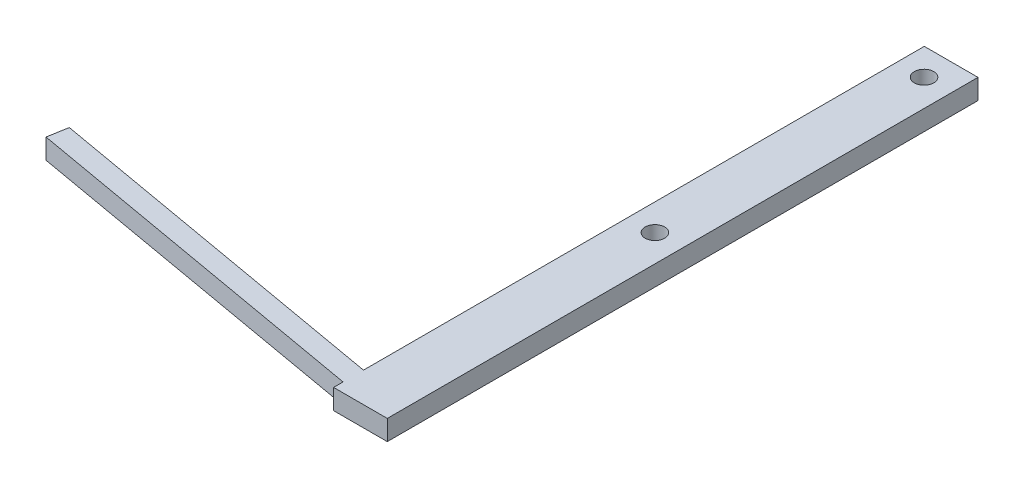
ISO-10303-21;
HEADER;
FILE_DESCRIPTION(('STEP AP214'),'2;1');
FILE_NAME('part.step','',(''),(''),'','','');
FILE_SCHEMA(('AUTOMOTIVE_DESIGN { 1 0 10303 214 1 1 1 1 }'));
ENDSEC;
DATA;
#1=APPLICATION_CONTEXT('core data for automotive mechanical design processes');
#2=APPLICATION_PROTOCOL_DEFINITION('international standard','automotive_design',2000,#1);
#3=PRODUCT_CONTEXT('',#1,'mechanical');
#4=PRODUCT('Part','Part','',(#3));
#5=PRODUCT_RELATED_PRODUCT_CATEGORY('part','',(#4));
#6=PRODUCT_DEFINITION_FORMATION('','',#4);
#7=PRODUCT_DEFINITION_CONTEXT('part definition',#1,'design');
#8=PRODUCT_DEFINITION('design','',#6,#7);
#9=PRODUCT_DEFINITION_SHAPE('','',#8);
#10=(LENGTH_UNIT() NAMED_UNIT(*) SI_UNIT(.MILLI.,.METRE.));
#11=(NAMED_UNIT(*) PLANE_ANGLE_UNIT() SI_UNIT($,.RADIAN.));
#12=(NAMED_UNIT(*) SI_UNIT($,.STERADIAN.) SOLID_ANGLE_UNIT());
#13=UNCERTAINTY_MEASURE_WITH_UNIT(LENGTH_MEASURE(1.E-05),#10,'distance_accuracy_value','');
#14=(GEOMETRIC_REPRESENTATION_CONTEXT(3) GLOBAL_UNCERTAINTY_ASSIGNED_CONTEXT((#13)) GLOBAL_UNIT_ASSIGNED_CONTEXT((#10,
#11,#12)) REPRESENTATION_CONTEXT('',''));
#15=CARTESIAN_POINT('',(0.,0.,0.));
#16=DIRECTION('',(0.,0.,1.));
#17=DIRECTION('',(1.,0.,0.));
#18=AXIS2_PLACEMENT_3D('',#15,#16,#17);
#19=CARTESIAN_POINT('',(0.,4.7625,-101.537542425712));
#20=DIRECTION('',(1.,0.,0.));
#21=DIRECTION('',(0.,0.,-1.));
#22=AXIS2_PLACEMENT_3D('',#19,#20,#21);
#23=PLANE('',#22);
#24=DIRECTION('',(0.,-1.,0.));
#25=VECTOR('',#24,1.);
#26=CARTESIAN_POINT('',(0.,92.3029556426417,31.0871356801851));
#27=LINE('',#26,#25);
#28=CARTESIAN_POINT('',(0.,4.7625,31.0871356801851));
#29=VERTEX_POINT('',#28);
#30=CARTESIAN_POINT('',(0.,0.,31.0871356801851));
#31=VERTEX_POINT('',#30);
#32=EDGE_CURVE('E58',#29,#31,#27,.T.);
#33=ORIENTED_EDGE('',*,*,#32,.F.);
#34=DIRECTION('',(0.,0.,1.));
#35=VECTOR('',#34,1.);
#36=CARTESIAN_POINT('',(0.,4.7625,-101.537542425712));
#37=LINE('',#36,#35);
#38=CARTESIAN_POINT('',(0.,4.7625,-101.537542425712));
#39=VERTEX_POINT('',#38);
#40=EDGE_CURVE('E153',#39,#29,#37,.T.);
#41=ORIENTED_EDGE('',*,*,#40,.F.);
#42=DIRECTION('',(0.,-1.,0.));
#43=VECTOR('',#42,1.);
#44=CARTESIAN_POINT('',(0.,4.7625,-101.537542425712));
#45=LINE('',#44,#43);
#46=CARTESIAN_POINT('',(0.,0.,-101.537542425712));
#47=VERTEX_POINT('',#46);
#48=EDGE_CURVE('E161',#39,#47,#45,.T.);
#49=ORIENTED_EDGE('',*,*,#48,.T.);
#50=DIRECTION('',(0.,0.,1.));
#51=VECTOR('',#50,1.);
#52=CARTESIAN_POINT('',(0.,0.,-101.537542425712));
#53=LINE('',#52,#51);
#54=EDGE_CURVE('E162',#47,#31,#53,.T.);
#55=ORIENTED_EDGE('',*,*,#54,.T.);
#56=EDGE_LOOP('',(#33,#41,#49,#55));
#57=FACE_BOUND('',#56,.T.);
#58=ADVANCED_FACE('F35',(#57),#23,.F.);
#59=CARTESIAN_POINT('',(0.,4.7625,0.));
#60=DIRECTION('',(0.,1.,0.));
#61=DIRECTION('',(0.,0.,1.));
#62=AXIS2_PLACEMENT_3D('',#59,#60,#61);
#63=PLANE('',#62);
#64=CARTESIAN_POINT('',(6.29321488132639,4.7625,-95.1875424257115));
#65=DIRECTION('',(0.,1.,0.));
#66=DIRECTION('',(0.,0.,1.));
#67=AXIS2_PLACEMENT_3D('',#64,#65,#66);
#68=CIRCLE('',#67,2.31);
#69=CARTESIAN_POINT('',(6.29321488132639,4.7625,-97.4975424257115));
#70=VERTEX_POINT('',#69);
#71=EDGE_CURVE('E148',#70,#70,#68,.T.);
#72=ORIENTED_EDGE('',*,*,#71,.F.);
#73=EDGE_LOOP('',(#72));
#74=FACE_BOUND('',#73,.T.);
#75=ORIENTED_EDGE('',*,*,#40,.T.);
#76=DIRECTION('',(0.984807753012209,0.,0.173648177666927));
#77=VECTOR('',#76,1.);
#78=CARTESIAN_POINT('',(-5.31621330046063,4.7625,30.1497438401127));
#79=LINE('',#78,#77);
#80=CARTESIAN_POINT('',(-84.461371978576,4.7625,16.1943169727086));
#81=VERTEX_POINT('',#80);
#82=EDGE_CURVE('E129',#81,#29,#79,.T.);
#83=ORIENTED_EDGE('',*,*,#82,.F.);
#84=DIRECTION('',(0.173648177666925,0.,-0.984807753012209));
#85=VECTOR('',#84,1.);
#86=CARTESIAN_POINT('',(-79.1451586781155,4.7625,-13.9554268674041));
#87=LINE('',#86,#85);
#88=CARTESIAN_POINT('',(-85.2883714247147,4.7625,20.8844638964292));
#89=VERTEX_POINT('',#88);
#90=EDGE_CURVE('E111',#89,#81,#87,.T.);
#91=ORIENTED_EDGE('',*,*,#90,.F.);
#92=DIRECTION('',(-0.984807753012209,0.,-0.173648177666928));
#93=VECTOR('',#92,1.);
#94=CARTESIAN_POINT('',(-6.14321274659937,4.7625,34.8398907638334));
#95=LINE('',#94,#93);
#96=CARTESIAN_POINT('',(0.,4.7625,35.923104919291));
#97=VERTEX_POINT('',#96);
#98=EDGE_CURVE('E108',#97,#89,#95,.T.);
#99=ORIENTED_EDGE('',*,*,#98,.F.);
#100=CARTESIAN_POINT('',(0.,4.7625,38.1624575742885));
#101=VERTEX_POINT('',#100);
#102=EDGE_CURVE('E50',#97,#101,#37,.T.);
#103=ORIENTED_EDGE('',*,*,#102,.T.);
#104=DIRECTION('',(1.,0.,0.));
#105=VECTOR('',#104,1.);
#106=CARTESIAN_POINT('',(0.,4.7625,38.1624575742885));
#107=LINE('',#106,#105);
#108=CARTESIAN_POINT('',(12.7,4.7625,38.1624575742885));
#109=VERTEX_POINT('',#108);
#110=EDGE_CURVE('E155',#101,#109,#107,.T.);
#111=ORIENTED_EDGE('',*,*,#110,.T.);
#112=DIRECTION('',(0.,0.,-1.));
#113=VECTOR('',#112,1.);
#114=CARTESIAN_POINT('',(12.7,4.7625,-101.537542425712));
#115=LINE('',#114,#113);
#116=CARTESIAN_POINT('',(12.7,4.7625,-101.537542425712));
#117=VERTEX_POINT('',#116);
#118=EDGE_CURVE('E157',#109,#117,#115,.T.);
#119=ORIENTED_EDGE('',*,*,#118,.T.);
#120=DIRECTION('',(-1.,0.,0.));
#121=VECTOR('',#120,1.);
#122=CARTESIAN_POINT('',(0.,4.7625,-101.537542425712));
#123=LINE('',#122,#121);
#124=EDGE_CURVE('E159',#117,#39,#123,.T.);
#125=ORIENTED_EDGE('',*,*,#124,.T.);
#126=EDGE_LOOP('',(#75,#83,#91,#99,#103,#111,#119,#125));
#127=FACE_BOUND('',#126,.T.);
#128=CARTESIAN_POINT('',(6.29321488132706,4.7625,-31.5375424257115));
#129=DIRECTION('',(0.,1.,0.));
#130=DIRECTION('',(0.,0.,1.));
#131=AXIS2_PLACEMENT_3D('',#128,#129,#130);
#132=CIRCLE('',#131,2.31);
#133=CARTESIAN_POINT('',(6.29321488132706,4.7625,-33.8475424257115));
#134=VERTEX_POINT('',#133);
#135=EDGE_CURVE('E142',#134,#134,#132,.T.);
#136=ORIENTED_EDGE('',*,*,#135,.F.);
#137=EDGE_LOOP('',(#136));
#138=FACE_BOUND('',#137,.T.);
#139=ADVANCED_FACE('F189',(#74,#127,#138),#63,.T.);
#140=CARTESIAN_POINT('',(0.,0.,0.));
#141=DIRECTION('',(0.,1.,0.));
#142=DIRECTION('',(0.,0.,1.));
#143=AXIS2_PLACEMENT_3D('',#140,#141,#142);
#144=PLANE('',#143);
#145=ORIENTED_EDGE('',*,*,#54,.F.);
#146=DIRECTION('',(-1.,0.,0.));
#147=VECTOR('',#146,1.);
#148=CARTESIAN_POINT('',(0.,0.,-101.537542425712));
#149=LINE('',#148,#147);
#150=CARTESIAN_POINT('',(12.7,0.,-101.537542425712));
#151=VERTEX_POINT('',#150);
#152=EDGE_CURVE('E168',#151,#47,#149,.T.);
#153=ORIENTED_EDGE('',*,*,#152,.F.);
#154=DIRECTION('',(0.,0.,-1.));
#155=VECTOR('',#154,1.);
#156=CARTESIAN_POINT('',(12.7,0.,-101.537542425712));
#157=LINE('',#156,#155);
#158=CARTESIAN_POINT('',(12.7,0.,38.1624575742885));
#159=VERTEX_POINT('',#158);
#160=EDGE_CURVE('E166',#159,#151,#157,.T.);
#161=ORIENTED_EDGE('',*,*,#160,.F.);
#162=DIRECTION('',(1.,0.,0.));
#163=VECTOR('',#162,1.);
#164=CARTESIAN_POINT('',(0.,0.,38.1624575742885));
#165=LINE('',#164,#163);
#166=CARTESIAN_POINT('',(0.,0.,38.1624575742885));
#167=VERTEX_POINT('',#166);
#168=EDGE_CURVE('E164',#167,#159,#165,.T.);
#169=ORIENTED_EDGE('',*,*,#168,.F.);
#170=CARTESIAN_POINT('',(0.,0.,35.923104919291));
#171=VERTEX_POINT('',#170);
#172=EDGE_CURVE('E128',#171,#167,#53,.T.);
#173=ORIENTED_EDGE('',*,*,#172,.F.);
#174=DIRECTION('',(-0.984807753012209,0.,-0.173648177666928));
#175=VECTOR('',#174,1.);
#176=CARTESIAN_POINT('',(-6.14321274659937,0.,34.8398907638334));
#177=LINE('',#176,#175);
#178=CARTESIAN_POINT('',(-85.2883714247147,0.,20.8844638964292));
#179=VERTEX_POINT('',#178);
#180=EDGE_CURVE('E107',#171,#179,#177,.T.);
#181=ORIENTED_EDGE('',*,*,#180,.T.);
#182=DIRECTION('',(0.173648177666925,0.,-0.984807753012209));
#183=VECTOR('',#182,1.);
#184=CARTESIAN_POINT('',(-79.1451586781155,0.,-13.9554268674041));
#185=LINE('',#184,#183);
#186=CARTESIAN_POINT('',(-84.461371978576,0.,16.1943169727085));
#187=VERTEX_POINT('',#186);
#188=EDGE_CURVE('E114',#179,#187,#185,.T.);
#189=ORIENTED_EDGE('',*,*,#188,.T.);
#190=DIRECTION('',(0.984807753012209,0.,0.173648177666927));
#191=VECTOR('',#190,1.);
#192=CARTESIAN_POINT('',(-5.31621330046063,0.,30.1497438401127));
#193=LINE('',#192,#191);
#194=EDGE_CURVE('E121',#187,#31,#193,.T.);
#195=ORIENTED_EDGE('',*,*,#194,.T.);
#196=EDGE_LOOP('',(#145,#153,#161,#169,#173,#181,#189,#195));
#197=FACE_BOUND('',#196,.T.);
#198=CARTESIAN_POINT('',(6.29321488132639,0.,-95.1875424257115));
#199=DIRECTION('',(0.,1.,0.));
#200=DIRECTION('',(0.,0.,1.));
#201=AXIS2_PLACEMENT_3D('',#198,#199,#200);
#202=CIRCLE('',#201,2.31);
#203=CARTESIAN_POINT('',(6.29321488132639,0.,-97.4975424257115));
#204=VERTEX_POINT('',#203);
#205=EDGE_CURVE('E145',#204,#204,#202,.T.);
#206=ORIENTED_EDGE('',*,*,#205,.T.);
#207=EDGE_LOOP('',(#206));
#208=FACE_BOUND('',#207,.T.);
#209=CARTESIAN_POINT('',(6.29321488132706,0.,-31.5375424257115));
#210=DIRECTION('',(0.,1.,0.));
#211=DIRECTION('',(0.,0.,1.));
#212=AXIS2_PLACEMENT_3D('',#209,#210,#211);
#213=CIRCLE('',#212,2.31);
#214=CARTESIAN_POINT('',(6.29321488132706,0.,-33.8475424257115));
#215=VERTEX_POINT('',#214);
#216=EDGE_CURVE('E141',#215,#215,#213,.T.);
#217=ORIENTED_EDGE('',*,*,#216,.T.);
#218=EDGE_LOOP('',(#217));
#219=FACE_BOUND('',#218,.T.);
#220=ADVANCED_FACE('F125',(#197,#208,#219),#144,.F.);
#221=ORIENTED_EDGE('',*,*,#102,.F.);
#222=DIRECTION('',(0.,-1.,0.));
#223=VECTOR('',#222,1.);
#224=CARTESIAN_POINT('',(0.,92.3029556426417,35.923104919291));
#225=LINE('',#224,#223);
#226=EDGE_CURVE('E136',#97,#171,#225,.T.);
#227=ORIENTED_EDGE('',*,*,#226,.T.);
#228=ORIENTED_EDGE('',*,*,#172,.T.);
#229=DIRECTION('',(0.,-1.,0.));
#230=VECTOR('',#229,1.);
#231=CARTESIAN_POINT('',(0.,4.7625,38.1624575742885));
#232=LINE('',#231,#230);
#233=EDGE_CURVE('E11',#101,#167,#232,.T.);
#234=ORIENTED_EDGE('',*,*,#233,.F.);
#235=EDGE_LOOP('',(#221,#227,#228,#234));
#236=FACE_BOUND('',#235,.T.);
#237=ADVANCED_FACE('F37',(#236),#23,.F.);
#238=CARTESIAN_POINT('',(0.,4.7625,38.1624575742885));
#239=DIRECTION('',(0.,0.,-1.));
#240=DIRECTION('',(-1.,0.,0.));
#241=AXIS2_PLACEMENT_3D('',#238,#239,#240);
#242=PLANE('',#241);
#243=ORIENTED_EDGE('',*,*,#168,.T.);
#244=DIRECTION('',(0.,-1.,0.));
#245=VECTOR('',#244,1.);
#246=CARTESIAN_POINT('',(12.7,4.7625,38.1624575742885));
#247=LINE('',#246,#245);
#248=EDGE_CURVE('E43',#109,#159,#247,.T.);
#249=ORIENTED_EDGE('',*,*,#248,.F.);
#250=ORIENTED_EDGE('',*,*,#110,.F.);
#251=ORIENTED_EDGE('',*,*,#233,.T.);
#252=EDGE_LOOP('',(#243,#249,#250,#251));
#253=FACE_BOUND('',#252,.T.);
#254=ADVANCED_FACE('F211',(#253),#242,.F.);
#255=CARTESIAN_POINT('',(12.7,4.7625,-101.537542425712));
#256=DIRECTION('',(-1.,0.,0.));
#257=DIRECTION('',(0.,0.,1.));
#258=AXIS2_PLACEMENT_3D('',#255,#256,#257);
#259=PLANE('',#258);
#260=ORIENTED_EDGE('',*,*,#160,.T.);
#261=DIRECTION('',(0.,-1.,0.));
#262=VECTOR('',#261,1.);
#263=CARTESIAN_POINT('',(12.7,4.7625,-101.537542425712));
#264=LINE('',#263,#262);
#265=EDGE_CURVE('E172',#117,#151,#264,.T.);
#266=ORIENTED_EDGE('',*,*,#265,.F.);
#267=ORIENTED_EDGE('',*,*,#118,.F.);
#268=ORIENTED_EDGE('',*,*,#248,.T.);
#269=EDGE_LOOP('',(#260,#266,#267,#268));
#270=FACE_BOUND('',#269,.T.);
#271=ADVANCED_FACE('F179',(#270),#259,.F.);
#272=CARTESIAN_POINT('',(0.,4.7625,-101.537542425712));
#273=DIRECTION('',(0.,0.,1.));
#274=DIRECTION('',(1.,0.,0.));
#275=AXIS2_PLACEMENT_3D('',#272,#273,#274);
#276=PLANE('',#275);
#277=ORIENTED_EDGE('',*,*,#152,.T.);
#278=ORIENTED_EDGE('',*,*,#48,.F.);
#279=ORIENTED_EDGE('',*,*,#124,.F.);
#280=ORIENTED_EDGE('',*,*,#265,.T.);
#281=EDGE_LOOP('',(#277,#278,#279,#280));
#282=FACE_BOUND('',#281,.T.);
#283=ADVANCED_FACE('F186',(#282),#276,.F.);
#284=CARTESIAN_POINT('',(6.29321488132639,4.7625,-95.1875424257115));
#285=DIRECTION('',(0.,-1.,0.));
#286=DIRECTION('',(0.,0.,-1.));
#287=AXIS2_PLACEMENT_3D('',#284,#285,#286);
#288=CYLINDRICAL_SURFACE('',#287,2.31);
#289=CARTESIAN_POINT('',(6.29321488132639,4.7625,-97.4975424257115));
#290=CARTESIAN_POINT('',(6.29321488132639,4.712890625,-97.4975424257115));
#291=CARTESIAN_POINT('',(6.29321488132639,4.66328125,-97.4975424257115));
#292=CARTESIAN_POINT('',(6.29321488132639,4.5640625,-97.4975424257115));
#293=CARTESIAN_POINT('',(6.29321488132639,4.514453125,-97.4975424257115));
#294=CARTESIAN_POINT('',(6.29321488132639,4.415234375,-97.4975424257115));
#295=CARTESIAN_POINT('',(6.29321488132639,4.365625,-97.4975424257115));
#296=CARTESIAN_POINT('',(6.29321488132639,4.26640625,-97.4975424257115));
#297=CARTESIAN_POINT('',(6.29321488132639,4.216796875,-97.4975424257115));
#298=CARTESIAN_POINT('',(6.29321488132639,4.117578125,-97.4975424257115));
#299=CARTESIAN_POINT('',(6.29321488132639,4.06796875,-97.4975424257115));
#300=CARTESIAN_POINT('',(6.29321488132639,3.96875,-97.4975424257115));
#301=CARTESIAN_POINT('',(6.29321488132639,3.919140625,-97.4975424257115));
#302=CARTESIAN_POINT('',(6.29321488132639,3.819921875,-97.4975424257115));
#303=CARTESIAN_POINT('',(6.29321488132639,3.7703125,-97.4975424257115));
#304=CARTESIAN_POINT('',(6.29321488132639,3.67109375,-97.4975424257115));
#305=CARTESIAN_POINT('',(6.29321488132639,3.621484375,-97.4975424257115));
#306=CARTESIAN_POINT('',(6.29321488132639,3.522265625,-97.4975424257115));
#307=CARTESIAN_POINT('',(6.29321488132639,3.47265625,-97.4975424257115));
#308=CARTESIAN_POINT('',(6.29321488132639,3.3734375,-97.4975424257115));
#309=CARTESIAN_POINT('',(6.29321488132639,3.323828125,-97.4975424257115));
#310=CARTESIAN_POINT('',(6.29321488132639,3.224609375,-97.4975424257115));
#311=CARTESIAN_POINT('',(6.29321488132639,3.175,-97.4975424257115));
#312=CARTESIAN_POINT('',(6.29321488132639,3.07578125,-97.4975424257115));
#313=CARTESIAN_POINT('',(6.29321488132639,3.026171875,-97.4975424257115));
#314=CARTESIAN_POINT('',(6.29321488132639,2.926953125,-97.4975424257115));
#315=CARTESIAN_POINT('',(6.29321488132639,2.87734375,-97.4975424257115));
#316=CARTESIAN_POINT('',(6.29321488132639,2.778125,-97.4975424257115));
#317=CARTESIAN_POINT('',(6.29321488132639,2.728515625,-97.4975424257115));
#318=CARTESIAN_POINT('',(6.29321488132639,2.629296875,-97.4975424257115));
#319=CARTESIAN_POINT('',(6.29321488132639,2.5796875,-97.4975424257115));
#320=CARTESIAN_POINT('',(6.29321488132639,2.48046875,-97.4975424257115));
#321=CARTESIAN_POINT('',(6.29321488132639,2.430859375,-97.4975424257115));
#322=CARTESIAN_POINT('',(6.29321488132639,2.331640625,-97.4975424257115));
#323=CARTESIAN_POINT('',(6.29321488132639,2.28203125,-97.4975424257115));
#324=CARTESIAN_POINT('',(6.29321488132639,2.1828125,-97.4975424257115));
#325=CARTESIAN_POINT('',(6.29321488132639,2.133203125,-97.4975424257115));
#326=CARTESIAN_POINT('',(6.29321488132639,2.033984375,-97.4975424257115));
#327=CARTESIAN_POINT('',(6.29321488132639,1.984375,-97.4975424257115));
#328=CARTESIAN_POINT('',(6.29321488132639,1.88515625,-97.4975424257115));
#329=CARTESIAN_POINT('',(6.29321488132639,1.835546875,-97.4975424257115));
#330=CARTESIAN_POINT('',(6.29321488132639,1.736328125,-97.4975424257115));
#331=CARTESIAN_POINT('',(6.29321488132639,1.68671875,-97.4975424257115));
#332=CARTESIAN_POINT('',(6.29321488132639,1.5875,-97.4975424257115));
#333=CARTESIAN_POINT('',(6.29321488132639,1.537890625,-97.4975424257115));
#334=CARTESIAN_POINT('',(6.29321488132639,1.438671875,-97.4975424257115));
#335=CARTESIAN_POINT('',(6.29321488132639,1.3890625,-97.4975424257115));
#336=CARTESIAN_POINT('',(6.29321488132639,1.28984375,-97.4975424257115));
#337=CARTESIAN_POINT('',(6.29321488132639,1.240234375,-97.4975424257115));
#338=CARTESIAN_POINT('',(6.29321488132639,1.141015625,-97.4975424257115));
#339=CARTESIAN_POINT('',(6.29321488132639,1.09140625,-97.4975424257115));
#340=CARTESIAN_POINT('',(6.29321488132639,0.9921875,-97.4975424257115));
#341=CARTESIAN_POINT('',(6.29321488132639,0.942578125,-97.4975424257115));
#342=CARTESIAN_POINT('',(6.29321488132639,0.843359375,-97.4975424257115));
#343=CARTESIAN_POINT('',(6.29321488132639,0.79375,-97.4975424257115));
#344=CARTESIAN_POINT('',(6.29321488132639,0.69453125,-97.4975424257115));
#345=CARTESIAN_POINT('',(6.29321488132639,0.644921875,-97.4975424257115));
#346=CARTESIAN_POINT('',(6.29321488132639,0.545703125,-97.4975424257115));
#347=CARTESIAN_POINT('',(6.29321488132639,0.49609375,-97.4975424257115));
#348=CARTESIAN_POINT('',(6.29321488132639,0.396875,-97.4975424257115));
#349=CARTESIAN_POINT('',(6.29321488132639,0.347265625,-97.4975424257115));
#350=CARTESIAN_POINT('',(6.29321488132639,0.248046875,-97.4975424257115));
#351=CARTESIAN_POINT('',(6.29321488132639,0.1984375,-97.4975424257115));
#352=CARTESIAN_POINT('',(6.29321488132639,0.09921875,-97.4975424257115));
#353=CARTESIAN_POINT('',(6.29321488132639,0.049609375,-97.4975424257115));
#354=CARTESIAN_POINT('',(6.29321488132639,0.,-97.4975424257115));
#355=B_SPLINE_CURVE_WITH_KNOTS('',3,(#289,#290,#291,#292,#293,#294,#295,#296,#297,#298,#299,
#300,#301,#302,#303,#304,#305,#306,#307,#308,#309,#310,#311,#312,#313,#314,#315,#316,#317,#318,
#319,#320,#321,#322,#323,#324,#325,#326,#327,#328,#329,#330,#331,#332,#333,#334,#335,#336,#337,
#338,#339,#340,#341,#342,#343,#344,#345,#346,#347,#348,#349,#350,#351,#352,#353,#354),
.UNSPECIFIED.,.F.,.F.,(4,2,2,2,2,2,2,2,2,2,2,2,2,2,2,2,2,2,2,2,2,2,2,2,2,2,2,2,2,2,2,2,4),(0.,
0.148828124999999,0.297656249999999,0.446484374999999,0.595312499999999,0.744140625,0.89296875,
1.041796875,1.190625,1.339453125,1.48828125,1.637109375,1.7859375,1.934765625,2.08359375,
2.232421875,2.38125,2.530078125,2.67890625,2.827734375,2.9765625,3.125390625,3.27421875,
3.423046875,3.571875,3.720703125,3.86953125,4.018359375,4.1671875,4.316015625,4.46484375,
4.613671875,4.7625),.UNSPECIFIED.);
#356=EDGE_CURVE('BSEAM201',#70,#204,#355,.T.);
#357=ORIENTED_EDGE('',*,*,#71,.T.);
#358=ORIENTED_EDGE('',*,*,#205,.F.);
#359=ORIENTED_EDGE('',*,*,#356,.T.);
#360=ORIENTED_EDGE('',*,*,#356,.F.);
#361=EDGE_LOOP('',(#357,#359,#358,#360));
#362=FACE_BOUND('',#361,.T.);
#363=ADVANCED_FACE('F201',(#362),#288,.F.);
#364=CARTESIAN_POINT('',(6.29321488132706,4.7625,-31.5375424257115));
#365=DIRECTION('',(0.,-1.,0.));
#366=DIRECTION('',(0.,0.,-1.));
#367=AXIS2_PLACEMENT_3D('',#364,#365,#366);
#368=CYLINDRICAL_SURFACE('',#367,2.31);
#369=CARTESIAN_POINT('',(6.29321488132706,4.7625,-33.8475424257115));
#370=CARTESIAN_POINT('',(6.29321488132706,4.712890625,-33.8475424257115));
#371=CARTESIAN_POINT('',(6.29321488132706,4.66328125,-33.8475424257115));
#372=CARTESIAN_POINT('',(6.29321488132706,4.5640625,-33.8475424257115));
#373=CARTESIAN_POINT('',(6.29321488132706,4.514453125,-33.8475424257115));
#374=CARTESIAN_POINT('',(6.29321488132706,4.415234375,-33.8475424257115));
#375=CARTESIAN_POINT('',(6.29321488132706,4.365625,-33.8475424257115));
#376=CARTESIAN_POINT('',(6.29321488132706,4.26640625,-33.8475424257115));
#377=CARTESIAN_POINT('',(6.29321488132706,4.216796875,-33.8475424257115));
#378=CARTESIAN_POINT('',(6.29321488132706,4.117578125,-33.8475424257115));
#379=CARTESIAN_POINT('',(6.29321488132706,4.06796875,-33.8475424257115));
#380=CARTESIAN_POINT('',(6.29321488132706,3.96875,-33.8475424257115));
#381=CARTESIAN_POINT('',(6.29321488132706,3.919140625,-33.8475424257115));
#382=CARTESIAN_POINT('',(6.29321488132706,3.819921875,-33.8475424257115));
#383=CARTESIAN_POINT('',(6.29321488132706,3.7703125,-33.8475424257115));
#384=CARTESIAN_POINT('',(6.29321488132706,3.67109375,-33.8475424257115));
#385=CARTESIAN_POINT('',(6.29321488132706,3.621484375,-33.8475424257115));
#386=CARTESIAN_POINT('',(6.29321488132706,3.522265625,-33.8475424257115));
#387=CARTESIAN_POINT('',(6.29321488132706,3.47265625,-33.8475424257115));
#388=CARTESIAN_POINT('',(6.29321488132706,3.3734375,-33.8475424257115));
#389=CARTESIAN_POINT('',(6.29321488132706,3.323828125,-33.8475424257115));
#390=CARTESIAN_POINT('',(6.29321488132706,3.224609375,-33.8475424257115));
#391=CARTESIAN_POINT('',(6.29321488132706,3.175,-33.8475424257115));
#392=CARTESIAN_POINT('',(6.29321488132706,3.07578125,-33.8475424257115));
#393=CARTESIAN_POINT('',(6.29321488132706,3.026171875,-33.8475424257115));
#394=CARTESIAN_POINT('',(6.29321488132706,2.926953125,-33.8475424257115));
#395=CARTESIAN_POINT('',(6.29321488132706,2.87734375,-33.8475424257115));
#396=CARTESIAN_POINT('',(6.29321488132706,2.778125,-33.8475424257115));
#397=CARTESIAN_POINT('',(6.29321488132706,2.728515625,-33.8475424257115));
#398=CARTESIAN_POINT('',(6.29321488132706,2.629296875,-33.8475424257115));
#399=CARTESIAN_POINT('',(6.29321488132706,2.5796875,-33.8475424257115));
#400=CARTESIAN_POINT('',(6.29321488132706,2.48046875,-33.8475424257115));
#401=CARTESIAN_POINT('',(6.29321488132706,2.430859375,-33.8475424257115));
#402=CARTESIAN_POINT('',(6.29321488132706,2.331640625,-33.8475424257115));
#403=CARTESIAN_POINT('',(6.29321488132706,2.28203125,-33.8475424257115));
#404=CARTESIAN_POINT('',(6.29321488132706,2.1828125,-33.8475424257115));
#405=CARTESIAN_POINT('',(6.29321488132706,2.133203125,-33.8475424257115));
#406=CARTESIAN_POINT('',(6.29321488132706,2.033984375,-33.8475424257115));
#407=CARTESIAN_POINT('',(6.29321488132706,1.984375,-33.8475424257115));
#408=CARTESIAN_POINT('',(6.29321488132706,1.88515625,-33.8475424257115));
#409=CARTESIAN_POINT('',(6.29321488132706,1.835546875,-33.8475424257115));
#410=CARTESIAN_POINT('',(6.29321488132706,1.736328125,-33.8475424257115));
#411=CARTESIAN_POINT('',(6.29321488132706,1.68671875,-33.8475424257115));
#412=CARTESIAN_POINT('',(6.29321488132706,1.5875,-33.8475424257115));
#413=CARTESIAN_POINT('',(6.29321488132706,1.537890625,-33.8475424257115));
#414=CARTESIAN_POINT('',(6.29321488132706,1.438671875,-33.8475424257115));
#415=CARTESIAN_POINT('',(6.29321488132706,1.3890625,-33.8475424257115));
#416=CARTESIAN_POINT('',(6.29321488132706,1.28984375,-33.8475424257115));
#417=CARTESIAN_POINT('',(6.29321488132706,1.240234375,-33.8475424257115));
#418=CARTESIAN_POINT('',(6.29321488132706,1.141015625,-33.8475424257115));
#419=CARTESIAN_POINT('',(6.29321488132706,1.09140625,-33.8475424257115));
#420=CARTESIAN_POINT('',(6.29321488132706,0.9921875,-33.8475424257115));
#421=CARTESIAN_POINT('',(6.29321488132706,0.942578125,-33.8475424257115));
#422=CARTESIAN_POINT('',(6.29321488132706,0.843359375,-33.8475424257115));
#423=CARTESIAN_POINT('',(6.29321488132706,0.79375,-33.8475424257115));
#424=CARTESIAN_POINT('',(6.29321488132706,0.69453125,-33.8475424257115));
#425=CARTESIAN_POINT('',(6.29321488132706,0.644921875,-33.8475424257115));
#426=CARTESIAN_POINT('',(6.29321488132706,0.545703125,-33.8475424257115));
#427=CARTESIAN_POINT('',(6.29321488132706,0.49609375,-33.8475424257115));
#428=CARTESIAN_POINT('',(6.29321488132706,0.396875,-33.8475424257115));
#429=CARTESIAN_POINT('',(6.29321488132706,0.347265625,-33.8475424257115));
#430=CARTESIAN_POINT('',(6.29321488132706,0.248046875,-33.8475424257115));
#431=CARTESIAN_POINT('',(6.29321488132706,0.1984375,-33.8475424257115));
#432=CARTESIAN_POINT('',(6.29321488132706,0.09921875,-33.8475424257115));
#433=CARTESIAN_POINT('',(6.29321488132706,0.049609375,-33.8475424257115));
#434=CARTESIAN_POINT('',(6.29321488132706,0.,-33.8475424257115));
#435=B_SPLINE_CURVE_WITH_KNOTS('',3,(#369,#370,#371,#372,#373,#374,#375,#376,#377,#378,#379,
#380,#381,#382,#383,#384,#385,#386,#387,#388,#389,#390,#391,#392,#393,#394,#395,#396,#397,#398,
#399,#400,#401,#402,#403,#404,#405,#406,#407,#408,#409,#410,#411,#412,#413,#414,#415,#416,#417,
#418,#419,#420,#421,#422,#423,#424,#425,#426,#427,#428,#429,#430,#431,#432,#433,#434),
.UNSPECIFIED.,.F.,.F.,(4,2,2,2,2,2,2,2,2,2,2,2,2,2,2,2,2,2,2,2,2,2,2,2,2,2,2,2,2,2,2,2,4),(0.,
0.148828124999999,0.297656249999999,0.446484374999999,0.595312499999999,0.744140625,0.89296875,
1.041796875,1.190625,1.339453125,1.48828125,1.637109375,1.7859375,1.934765625,2.08359375,
2.232421875,2.38125,2.530078125,2.67890625,2.827734375,2.9765625,3.125390625,3.27421875,
3.423046875,3.571875,3.720703125,3.86953125,4.018359375,4.1671875,4.316015625,4.46484375,
4.613671875,4.7625),.UNSPECIFIED.);
#436=EDGE_CURVE('BSEAM194',#134,#215,#435,.T.);
#437=ORIENTED_EDGE('',*,*,#135,.T.);
#438=ORIENTED_EDGE('',*,*,#216,.F.);
#439=ORIENTED_EDGE('',*,*,#436,.T.);
#440=ORIENTED_EDGE('',*,*,#436,.F.);
#441=EDGE_LOOP('',(#437,#439,#438,#440));
#442=FACE_BOUND('',#441,.T.);
#443=ADVANCED_FACE('F194',(#442),#368,.F.);
#444=CARTESIAN_POINT('',(-5.31621330046063,92.3029556426417,30.1497438401127));
#445=DIRECTION('',(0.173648177666927,0.,-0.984807753012209));
#446=DIRECTION('',(-0.984807753012209,0.,-0.173648177666927));
#447=AXIS2_PLACEMENT_3D('',#444,#445,#446);
#448=PLANE('',#447);
#449=DIRECTION('',(0.,-1.,0.));
#450=VECTOR('',#449,1.);
#451=CARTESIAN_POINT('',(-84.461371978576,92.3029556426417,16.1943169727085));
#452=LINE('',#451,#450);
#453=EDGE_CURVE('E117',#81,#187,#452,.T.);
#454=ORIENTED_EDGE('',*,*,#453,.F.);
#455=ORIENTED_EDGE('',*,*,#82,.T.);
#456=ORIENTED_EDGE('',*,*,#32,.T.);
#457=ORIENTED_EDGE('',*,*,#194,.F.);
#458=EDGE_LOOP('',(#454,#455,#456,#457));
#459=FACE_BOUND('',#458,.T.);
#460=ADVANCED_FACE('F192',(#459),#448,.T.);
#461=CARTESIAN_POINT('',(-6.14321274659937,92.3029556426417,34.8398907638334));
#462=DIRECTION('',(-0.173648177666928,0.,0.984807753012209));
#463=DIRECTION('',(0.984807753012209,0.,0.173648177666928));
#464=AXIS2_PLACEMENT_3D('',#461,#462,#463);
#465=PLANE('',#464);
#466=ORIENTED_EDGE('',*,*,#226,.F.);
#467=ORIENTED_EDGE('',*,*,#98,.T.);
#468=DIRECTION('',(0.,-1.,0.));
#469=VECTOR('',#468,1.);
#470=CARTESIAN_POINT('',(-85.2883714247147,92.3029556426417,20.8844638964292));
#471=LINE('',#470,#469);
#472=EDGE_CURVE('E102',#89,#179,#471,.T.);
#473=ORIENTED_EDGE('',*,*,#472,.T.);
#474=ORIENTED_EDGE('',*,*,#180,.F.);
#475=EDGE_LOOP('',(#466,#467,#473,#474));
#476=FACE_BOUND('',#475,.T.);
#477=ADVANCED_FACE('F105',(#476),#465,.T.);
#478=CARTESIAN_POINT('',(-79.1451586781155,92.3029556426417,-13.9554268674041));
#479=DIRECTION('',(-0.984807753012209,0.,-0.173648177666925));
#480=DIRECTION('',(-0.173648177666925,0.,0.984807753012209));
#481=AXIS2_PLACEMENT_3D('',#478,#479,#480);
#482=PLANE('',#481);
#483=ORIENTED_EDGE('',*,*,#472,.F.);
#484=ORIENTED_EDGE('',*,*,#90,.T.);
#485=ORIENTED_EDGE('',*,*,#453,.T.);
#486=ORIENTED_EDGE('',*,*,#188,.F.);
#487=EDGE_LOOP('',(#483,#484,#485,#486));
#488=FACE_BOUND('',#487,.T.);
#489=ADVANCED_FACE('F115',(#488),#482,.T.);
#490=CLOSED_SHELL('',(#58,#139,#220,#237,#254,#271,#283,#363,#443,#460,#477,#489));
#491=MANIFOLD_SOLID_BREP('B2',#490);
#492=ADVANCED_BREP_SHAPE_REPRESENTATION('',(#18,#491),#14);
#493=SHAPE_DEFINITION_REPRESENTATION(#9,#492);
ENDSEC;
END-ISO-10303-21;
